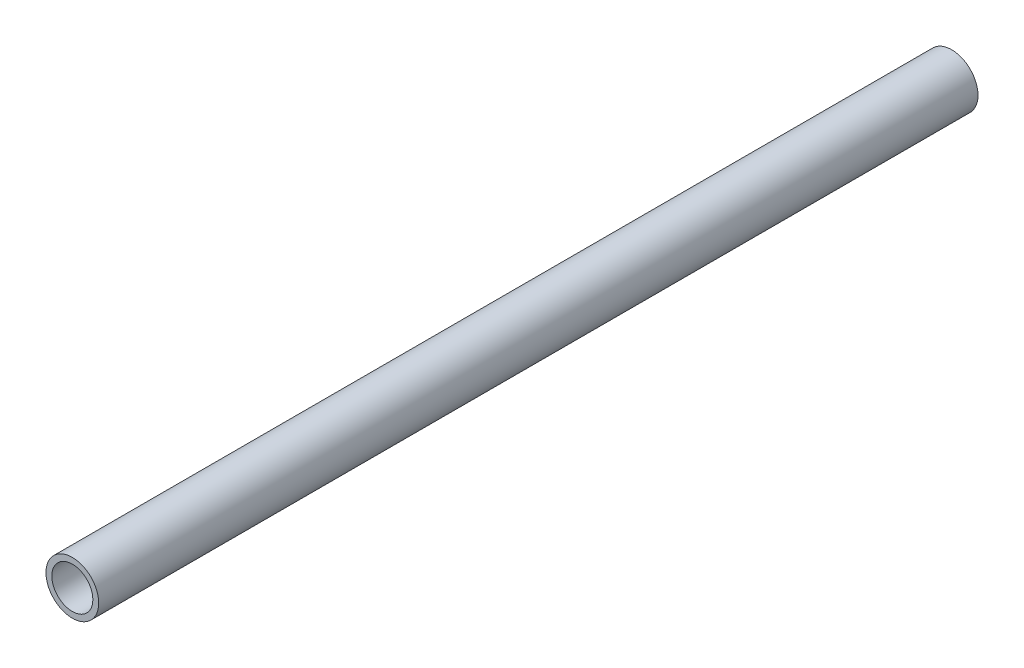
ISO-10303-21;
HEADER;
FILE_DESCRIPTION(('STEP AP214'),'2;1');
FILE_NAME('part.step','',(''),(''),'','','');
FILE_SCHEMA(('AUTOMOTIVE_DESIGN { 1 0 10303 214 1 1 1 1 }'));
ENDSEC;
DATA;
#1=APPLICATION_CONTEXT('core data for automotive mechanical design processes');
#2=APPLICATION_PROTOCOL_DEFINITION('international standard','automotive_design',2000,#1);
#3=PRODUCT_CONTEXT('',#1,'mechanical');
#4=PRODUCT('Part','Part','',(#3));
#5=PRODUCT_RELATED_PRODUCT_CATEGORY('part','',(#4));
#6=PRODUCT_DEFINITION_FORMATION('','',#4);
#7=PRODUCT_DEFINITION_CONTEXT('part definition',#1,'design');
#8=PRODUCT_DEFINITION('design','',#6,#7);
#9=PRODUCT_DEFINITION_SHAPE('','',#8);
#10=(LENGTH_UNIT() NAMED_UNIT(*) SI_UNIT(.MILLI.,.METRE.));
#11=(NAMED_UNIT(*) PLANE_ANGLE_UNIT() SI_UNIT($,.RADIAN.));
#12=(NAMED_UNIT(*) SI_UNIT($,.STERADIAN.) SOLID_ANGLE_UNIT());
#13=UNCERTAINTY_MEASURE_WITH_UNIT(LENGTH_MEASURE(1.E-05),#10,'distance_accuracy_value','');
#14=(GEOMETRIC_REPRESENTATION_CONTEXT(3) GLOBAL_UNCERTAINTY_ASSIGNED_CONTEXT((#13)) GLOBAL_UNIT_ASSIGNED_CONTEXT((#10,
#11,#12)) REPRESENTATION_CONTEXT('',''));
#15=CARTESIAN_POINT('',(0.,0.,0.));
#16=DIRECTION('',(0.,0.,1.));
#17=DIRECTION('',(1.,0.,0.));
#18=AXIS2_PLACEMENT_3D('',#15,#16,#17);
#19=CARTESIAN_POINT('',(0.,0.,300.06));
#20=DIRECTION('',(0.,0.,1.));
#21=DIRECTION('',(1.,0.,0.));
#22=AXIS2_PLACEMENT_3D('',#19,#20,#21);
#23=PLANE('',#22);
#24=CARTESIAN_POINT('',(0.,0.,300.06));
#25=DIRECTION('',(0.,0.,1.));
#26=DIRECTION('',(1.,0.,0.));
#27=AXIS2_PLACEMENT_3D('',#24,#25,#26);
#28=CIRCLE('',#27,9.);
#29=CARTESIAN_POINT('',(9.,0.,300.06));
#30=VERTEX_POINT('',#29);
#31=EDGE_CURVE('E10',#30,#30,#28,.T.);
#32=ORIENTED_EDGE('',*,*,#31,.T.);
#33=EDGE_LOOP('',(#32));
#34=FACE_BOUND('',#33,.T.);
#35=CARTESIAN_POINT('',(0.,0.,300.06));
#36=DIRECTION('',(0.,0.,1.));
#37=DIRECTION('',(1.,0.,0.));
#38=AXIS2_PLACEMENT_3D('',#35,#36,#37);
#39=CIRCLE('',#38,7.);
#40=CARTESIAN_POINT('',(7.,0.,300.06));
#41=VERTEX_POINT('',#40);
#42=EDGE_CURVE('E50',#41,#41,#39,.T.);
#43=ORIENTED_EDGE('',*,*,#42,.F.);
#44=EDGE_LOOP('',(#43));
#45=FACE_BOUND('',#44,.T.);
#46=ADVANCED_FACE('F37',(#34,#45),#23,.T.);
#47=CARTESIAN_POINT('',(0.,0.,0.));
#48=DIRECTION('',(0.,0.,1.));
#49=DIRECTION('',(1.,0.,0.));
#50=AXIS2_PLACEMENT_3D('',#47,#48,#49);
#51=PLANE('',#50);
#52=CARTESIAN_POINT('',(0.,0.,0.));
#53=DIRECTION('',(0.,0.,1.));
#54=DIRECTION('',(1.,0.,0.));
#55=AXIS2_PLACEMENT_3D('',#52,#53,#54);
#56=CIRCLE('',#55,9.);
#57=CARTESIAN_POINT('',(9.,0.,0.));
#58=VERTEX_POINT('',#57);
#59=EDGE_CURVE('E41',#58,#58,#56,.T.);
#60=ORIENTED_EDGE('',*,*,#59,.F.);
#61=EDGE_LOOP('',(#60));
#62=FACE_BOUND('',#61,.T.);
#63=CARTESIAN_POINT('',(0.,0.,0.));
#64=DIRECTION('',(0.,0.,1.));
#65=DIRECTION('',(1.,0.,0.));
#66=AXIS2_PLACEMENT_3D('',#63,#64,#65);
#67=CIRCLE('',#66,7.);
#68=CARTESIAN_POINT('',(7.,0.,0.));
#69=VERTEX_POINT('',#68);
#70=EDGE_CURVE('E52',#69,#69,#67,.T.);
#71=ORIENTED_EDGE('',*,*,#70,.T.);
#72=EDGE_LOOP('',(#71));
#73=FACE_BOUND('',#72,.T.);
#74=ADVANCED_FACE('F64',(#62,#73),#51,.F.);
#75=CARTESIAN_POINT('',(0.,0.,300.06));
#76=DIRECTION('',(0.,0.,-1.));
#77=DIRECTION('',(-1.,0.,0.));
#78=AXIS2_PLACEMENT_3D('',#75,#76,#77);
#79=CYLINDRICAL_SURFACE('',#78,9.);
#80=ORIENTED_EDGE('',*,*,#31,.F.);
#81=EDGE_LOOP('',(#80));
#82=FACE_BOUND('',#81,.T.);
#83=ORIENTED_EDGE('',*,*,#59,.T.);
#84=EDGE_LOOP('',(#83));
#85=FACE_BOUND('',#84,.T.);
#86=ADVANCED_FACE('F39',(#82,#85),#79,.T.);
#87=CARTESIAN_POINT('',(0.,0.,300.06));
#88=DIRECTION('',(0.,0.,-1.));
#89=DIRECTION('',(-1.,0.,0.));
#90=AXIS2_PLACEMENT_3D('',#87,#88,#89);
#91=CYLINDRICAL_SURFACE('',#90,7.);
#92=ORIENTED_EDGE('',*,*,#42,.T.);
#93=EDGE_LOOP('',(#92));
#94=FACE_BOUND('',#93,.T.);
#95=ORIENTED_EDGE('',*,*,#70,.F.);
#96=EDGE_LOOP('',(#95));
#97=FACE_BOUND('',#96,.T.);
#98=ADVANCED_FACE('F60',(#94,#97),#91,.F.);
#99=CLOSED_SHELL('',(#46,#74,#86,#98));
#100=MANIFOLD_SOLID_BREP('B2',#99);
#101=ADVANCED_BREP_SHAPE_REPRESENTATION('',(#18,#100),#14);
#102=SHAPE_DEFINITION_REPRESENTATION(#9,#101);
ENDSEC;
END-ISO-10303-21;
